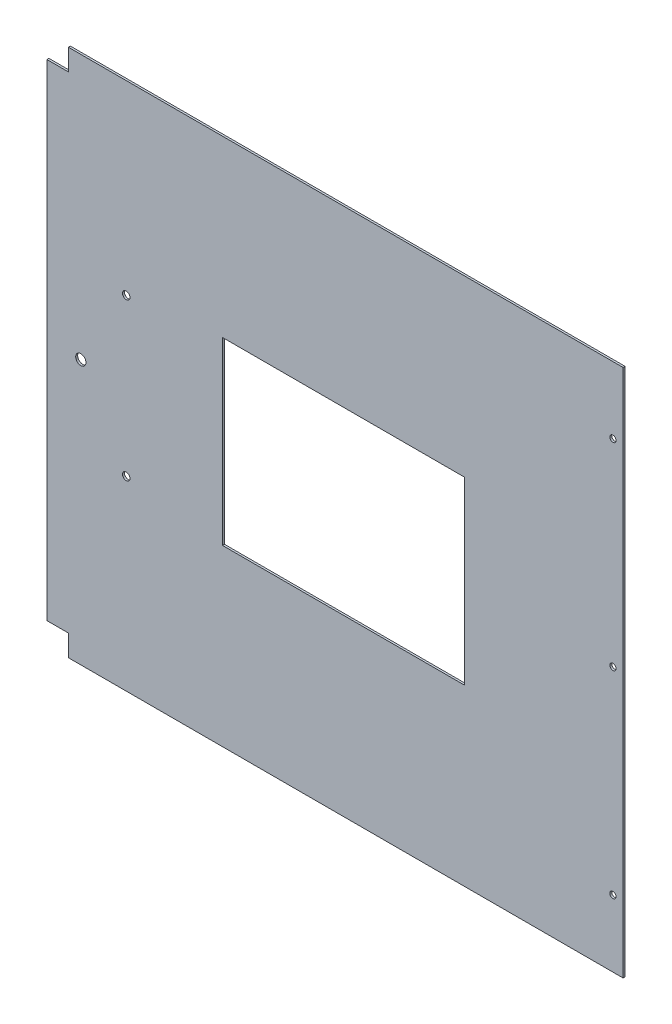
ISO-10303-21;
HEADER;
FILE_DESCRIPTION(('STEP AP214'),'2;1');
FILE_NAME('part.step','',(''),(''),'','','');
FILE_SCHEMA(('AUTOMOTIVE_DESIGN { 1 0 10303 214 1 1 1 1 }'));
ENDSEC;
DATA;
#1=APPLICATION_CONTEXT('core data for automotive mechanical design processes');
#2=APPLICATION_PROTOCOL_DEFINITION('international standard','automotive_design',2000,#1);
#3=PRODUCT_CONTEXT('',#1,'mechanical');
#4=PRODUCT('Part','Part','',(#3));
#5=PRODUCT_RELATED_PRODUCT_CATEGORY('part','',(#4));
#6=PRODUCT_DEFINITION_FORMATION('','',#4);
#7=PRODUCT_DEFINITION_CONTEXT('part definition',#1,'design');
#8=PRODUCT_DEFINITION('design','',#6,#7);
#9=PRODUCT_DEFINITION_SHAPE('','',#8);
#10=(LENGTH_UNIT() NAMED_UNIT(*) SI_UNIT(.MILLI.,.METRE.));
#11=(NAMED_UNIT(*) PLANE_ANGLE_UNIT() SI_UNIT($,.RADIAN.));
#12=(NAMED_UNIT(*) SI_UNIT($,.STERADIAN.) SOLID_ANGLE_UNIT());
#13=UNCERTAINTY_MEASURE_WITH_UNIT(LENGTH_MEASURE(1.E-05),#10,'distance_accuracy_value','');
#14=(GEOMETRIC_REPRESENTATION_CONTEXT(3) GLOBAL_UNCERTAINTY_ASSIGNED_CONTEXT((#13)) GLOBAL_UNIT_ASSIGNED_CONTEXT((#10,
#11,#12)) REPRESENTATION_CONTEXT('',''));
#15=CARTESIAN_POINT('',(0.,0.,0.));
#16=DIRECTION('',(0.,0.,1.));
#17=DIRECTION('',(1.,0.,0.));
#18=AXIS2_PLACEMENT_3D('',#15,#16,#17);
#19=CARTESIAN_POINT('',(0.,0.,-1.524));
#20=DIRECTION('',(0.,0.,-1.));
#21=DIRECTION('',(-1.,0.,0.));
#22=AXIS2_PLACEMENT_3D('',#19,#20,#21);
#23=PLANE('',#22);
#24=CARTESIAN_POINT('',(207.645,152.4,-1.524));
#25=DIRECTION('',(0.,0.,-1.));
#26=DIRECTION('',(-1.,0.,0.));
#27=AXIS2_PLACEMENT_3D('',#24,#25,#26);
#28=CIRCLE('',#27,2.413);
#29=CARTESIAN_POINT('',(205.232,152.4,-1.524));
#30=VERTEX_POINT('',#29);
#31=EDGE_CURVE('E327',#30,#30,#28,.T.);
#32=ORIENTED_EDGE('',*,*,#31,.F.);
#33=EDGE_LOOP('',(#32));
#34=FACE_BOUND('',#33,.T.);
#35=CARTESIAN_POINT('',(-167.767,-60.452,-1.524));
#36=DIRECTION('',(0.,0.,-1.));
#37=DIRECTION('',(-1.,0.,0.));
#38=AXIS2_PLACEMENT_3D('',#35,#36,#37);
#39=CIRCLE('',#38,2.8956);
#40=CARTESIAN_POINT('',(-170.6626,-60.452,-1.524));
#41=VERTEX_POINT('',#40);
#42=EDGE_CURVE('E482',#41,#41,#39,.T.);
#43=ORIENTED_EDGE('',*,*,#42,.F.);
#44=EDGE_LOOP('',(#43));
#45=FACE_BOUND('',#44,.T.);
#46=CARTESIAN_POINT('',(-167.767,60.452,-1.524));
#47=DIRECTION('',(0.,0.,-1.));
#48=DIRECTION('',(-1.,0.,0.));
#49=AXIS2_PLACEMENT_3D('',#46,#47,#48);
#50=CIRCLE('',#49,2.8956);
#51=CARTESIAN_POINT('',(-170.6626,60.452,-1.524));
#52=VERTEX_POINT('',#51);
#53=EDGE_CURVE('E478',#52,#52,#50,.T.);
#54=ORIENTED_EDGE('',*,*,#53,.F.);
#55=EDGE_LOOP('',(#54));
#56=FACE_BOUND('',#55,.T.);
#57=CARTESIAN_POINT('',(-202.819,0.,-1.524));
#58=DIRECTION('',(0.,0.,-1.));
#59=DIRECTION('',(-1.,0.,0.));
#60=AXIS2_PLACEMENT_3D('',#57,#58,#59);
#61=CIRCLE('',#60,3.9624);
#62=CARTESIAN_POINT('',(-206.7814,0.,-1.524));
#63=VERTEX_POINT('',#62);
#64=EDGE_CURVE('E474',#63,#63,#61,.T.);
#65=ORIENTED_EDGE('',*,*,#64,.F.);
#66=EDGE_LOOP('',(#65));
#67=FACE_BOUND('',#66,.T.);
#68=CARTESIAN_POINT('',(207.645,0.,-1.524));
#69=DIRECTION('',(0.,0.,-1.));
#70=DIRECTION('',(-1.,0.,0.));
#71=AXIS2_PLACEMENT_3D('',#68,#69,#70);
#72=CIRCLE('',#71,2.413);
#73=CARTESIAN_POINT('',(205.232,0.,-1.524));
#74=VERTEX_POINT('',#73);
#75=EDGE_CURVE('E470',#74,#74,#72,.T.);
#76=ORIENTED_EDGE('',*,*,#75,.F.);
#77=EDGE_LOOP('',(#76));
#78=FACE_BOUND('',#77,.T.);
#79=CARTESIAN_POINT('',(207.645,-152.4,-1.524));
#80=DIRECTION('',(0.,0.,-1.));
#81=DIRECTION('',(-1.,0.,0.));
#82=AXIS2_PLACEMENT_3D('',#79,#80,#81);
#83=CIRCLE('',#82,2.413);
#84=CARTESIAN_POINT('',(205.232,-152.4,-1.524));
#85=VERTEX_POINT('',#84);
#86=EDGE_CURVE('E466',#85,#85,#83,.T.);
#87=ORIENTED_EDGE('',*,*,#86,.F.);
#88=EDGE_LOOP('',(#87));
#89=FACE_BOUND('',#88,.T.);
#90=DIRECTION('',(0.,-1.,0.));
#91=VECTOR('',#90,1.);
#92=CARTESIAN_POINT('',(93.345,0.,-1.524));
#93=LINE('',#92,#91);
#94=CARTESIAN_POINT('',(93.345,69.469,-1.524));
#95=VERTEX_POINT('',#94);
#96=CARTESIAN_POINT('',(93.345,-69.469,-1.524));
#97=VERTEX_POINT('',#96);
#98=EDGE_CURVE('E463',#95,#97,#93,.T.);
#99=ORIENTED_EDGE('',*,*,#98,.F.);
#100=DIRECTION('',(1.,0.,0.));
#101=VECTOR('',#100,1.);
#102=CARTESIAN_POINT('',(0.,69.469,-1.524));
#103=LINE('',#102,#101);
#104=CARTESIAN_POINT('',(-93.599,69.469,-1.524));
#105=VERTEX_POINT('',#104);
#106=EDGE_CURVE('E447',#105,#95,#103,.T.);
#107=ORIENTED_EDGE('',*,*,#106,.F.);
#108=DIRECTION('',(0.,1.,0.));
#109=VECTOR('',#108,1.);
#110=CARTESIAN_POINT('',(-93.599,0.,-1.524));
#111=LINE('',#110,#109);
#112=CARTESIAN_POINT('',(-93.599,-69.469,-1.524));
#113=VERTEX_POINT('',#112);
#114=EDGE_CURVE('E457',#113,#105,#111,.T.);
#115=ORIENTED_EDGE('',*,*,#114,.F.);
#116=DIRECTION('',(-1.,0.,0.));
#117=VECTOR('',#116,1.);
#118=CARTESIAN_POINT('',(0.,-69.469,-1.524));
#119=LINE('',#118,#117);
#120=EDGE_CURVE('E460',#97,#113,#119,.T.);
#121=ORIENTED_EDGE('',*,*,#120,.F.);
#122=EDGE_LOOP('',(#99,#107,#115,#121));
#123=FACE_BOUND('',#122,.T.);
#124=DIRECTION('',(0.,1.,0.));
#125=VECTOR('',#124,1.);
#126=CARTESIAN_POINT('',(215.519,-190.5,-1.524));
#127=LINE('',#126,#125);
#128=CARTESIAN_POINT('',(215.519,-203.948962531012,-1.52399999999989));
#129=VERTEX_POINT('',#128);
#130=CARTESIAN_POINT('',(215.519,203.948962531012,-1.52399999999989));
#131=VERTEX_POINT('',#130);
#132=EDGE_CURVE('E326',#129,#131,#127,.T.);
#133=ORIENTED_EDGE('',*,*,#132,.F.);
#134=DIRECTION('',(-1.,0.,0.));
#135=VECTOR('',#134,1.);
#136=CARTESIAN_POINT('',(0.,-203.948962531012,-1.52399999999989));
#137=LINE('',#136,#135);
#138=CARTESIAN_POINT('',(-212.471,-203.948962531012,-1.52399999999989));
#139=VERTEX_POINT('',#138);
#140=EDGE_CURVE('E389',#129,#139,#137,.T.);
#141=ORIENTED_EDGE('',*,*,#140,.T.);
#142=DIRECTION('',(0.,1.,0.));
#143=VECTOR('',#142,1.);
#144=CARTESIAN_POINT('',(-212.471,-189.223481265506,-1.52400000000002));
#145=LINE('',#144,#143);
#146=CARTESIAN_POINT('',(-212.471,-187.452,-1.524));
#147=VERTEX_POINT('',#146);
#148=EDGE_CURVE('E399',#139,#147,#145,.T.);
#149=ORIENTED_EDGE('',*,*,#148,.T.);
#150=DIRECTION('',(-1.,0.,0.));
#151=VECTOR('',#150,1.);
#152=CARTESIAN_POINT('',(-214.242481265506,-187.452,-1.524));
#153=LINE('',#152,#151);
#154=CARTESIAN_POINT('',(-228.967962531012,-187.452,-1.52399999999991));
#155=VERTEX_POINT('',#154);
#156=EDGE_CURVE('E372',#147,#155,#153,.T.);
#157=ORIENTED_EDGE('',*,*,#156,.T.);
#158=DIRECTION('',(0.,1.,0.));
#159=VECTOR('',#158,1.);
#160=CARTESIAN_POINT('',(-228.967962531012,0.,-1.52399999999989));
#161=LINE('',#160,#159);
#162=CARTESIAN_POINT('',(-228.967962531012,187.452,-1.52399999999986));
#163=VERTEX_POINT('',#162);
#164=EDGE_CURVE('E361',#155,#163,#161,.T.);
#165=ORIENTED_EDGE('',*,*,#164,.T.);
#166=DIRECTION('',(-1.,0.,0.));
#167=VECTOR('',#166,1.);
#168=CARTESIAN_POINT('',(-214.242481265506,187.452,-1.524));
#169=LINE('',#168,#167);
#170=CARTESIAN_POINT('',(-212.471,187.452,-1.524));
#171=VERTEX_POINT('',#170);
#172=EDGE_CURVE('E375',#163,#171,#169,.F.);
#173=ORIENTED_EDGE('',*,*,#172,.T.);
#174=DIRECTION('',(0.,1.,0.));
#175=VECTOR('',#174,1.);
#176=CARTESIAN_POINT('',(-212.471,189.223481265506,-1.524));
#177=LINE('',#176,#175);
#178=CARTESIAN_POINT('',(-212.471,203.948962531012,-1.52399999999989));
#179=VERTEX_POINT('',#178);
#180=EDGE_CURVE('E349',#171,#179,#177,.T.);
#181=ORIENTED_EDGE('',*,*,#180,.T.);
#182=DIRECTION('',(-1.,0.,0.));
#183=VECTOR('',#182,1.);
#184=CARTESIAN_POINT('',(0.,203.948962531012,-1.52399999999989));
#185=LINE('',#184,#183);
#186=EDGE_CURVE('E336',#179,#131,#185,.F.);
#187=ORIENTED_EDGE('',*,*,#186,.T.);
#188=EDGE_LOOP('',(#133,#141,#149,#157,#165,#173,#181,#187));
#189=FACE_BOUND('',#188,.T.);
#190=ADVANCED_FACE('F224',(#34,#45,#56,#67,#78,#89,#123,#189),#23,.T.);
#191=CARTESIAN_POINT('',(0.,0.,0.));
#192=DIRECTION('',(0.,0.,-1.));
#193=DIRECTION('',(-1.,0.,0.));
#194=AXIS2_PLACEMENT_3D('',#191,#192,#193);
#195=PLANE('',#194);
#196=CARTESIAN_POINT('',(207.645,152.4,0.));
#197=DIRECTION('',(0.,0.,1.));
#198=DIRECTION('',(1.,0.,0.));
#199=AXIS2_PLACEMENT_3D('',#196,#197,#198);
#200=CIRCLE('',#199,2.413);
#201=CARTESIAN_POINT('',(210.058,152.4,0.));
#202=VERTEX_POINT('',#201);
#203=EDGE_CURVE('E411',#202,#202,#200,.T.);
#204=ORIENTED_EDGE('',*,*,#203,.F.);
#205=EDGE_LOOP('',(#204));
#206=FACE_BOUND('',#205,.T.);
#207=CARTESIAN_POINT('',(-167.767,-60.452,0.));
#208=DIRECTION('',(0.,0.,1.));
#209=DIRECTION('',(1.,0.,0.));
#210=AXIS2_PLACEMENT_3D('',#207,#208,#209);
#211=CIRCLE('',#210,2.8956);
#212=CARTESIAN_POINT('',(-164.8714,-60.452,0.));
#213=VERTEX_POINT('',#212);
#214=EDGE_CURVE('E415',#213,#213,#211,.T.);
#215=ORIENTED_EDGE('',*,*,#214,.F.);
#216=EDGE_LOOP('',(#215));
#217=FACE_BOUND('',#216,.T.);
#218=CARTESIAN_POINT('',(-167.767,60.452,0.));
#219=DIRECTION('',(0.,0.,1.));
#220=DIRECTION('',(1.,0.,0.));
#221=AXIS2_PLACEMENT_3D('',#218,#219,#220);
#222=CIRCLE('',#221,2.8956);
#223=CARTESIAN_POINT('',(-164.8714,60.452,0.));
#224=VERTEX_POINT('',#223);
#225=EDGE_CURVE('E419',#224,#224,#222,.T.);
#226=ORIENTED_EDGE('',*,*,#225,.F.);
#227=EDGE_LOOP('',(#226));
#228=FACE_BOUND('',#227,.T.);
#229=CARTESIAN_POINT('',(-202.819,0.,0.));
#230=DIRECTION('',(0.,0.,1.));
#231=DIRECTION('',(1.,0.,0.));
#232=AXIS2_PLACEMENT_3D('',#229,#230,#231);
#233=CIRCLE('',#232,3.9624);
#234=CARTESIAN_POINT('',(-198.8566,0.,0.));
#235=VERTEX_POINT('',#234);
#236=EDGE_CURVE('E423',#235,#235,#233,.T.);
#237=ORIENTED_EDGE('',*,*,#236,.F.);
#238=EDGE_LOOP('',(#237));
#239=FACE_BOUND('',#238,.T.);
#240=CARTESIAN_POINT('',(207.645,0.,0.));
#241=DIRECTION('',(0.,0.,1.));
#242=DIRECTION('',(1.,0.,0.));
#243=AXIS2_PLACEMENT_3D('',#240,#241,#242);
#244=CIRCLE('',#243,2.413);
#245=CARTESIAN_POINT('',(210.058,0.,0.));
#246=VERTEX_POINT('',#245);
#247=EDGE_CURVE('E407',#246,#246,#244,.T.);
#248=ORIENTED_EDGE('',*,*,#247,.F.);
#249=EDGE_LOOP('',(#248));
#250=FACE_BOUND('',#249,.T.);
#251=CARTESIAN_POINT('',(207.645,-152.4,0.));
#252=DIRECTION('',(0.,0.,1.));
#253=DIRECTION('',(1.,0.,0.));
#254=AXIS2_PLACEMENT_3D('',#251,#252,#253);
#255=CIRCLE('',#254,2.413);
#256=CARTESIAN_POINT('',(210.058,-152.4,0.));
#257=VERTEX_POINT('',#256);
#258=EDGE_CURVE('E403',#257,#257,#255,.T.);
#259=ORIENTED_EDGE('',*,*,#258,.F.);
#260=EDGE_LOOP('',(#259));
#261=FACE_BOUND('',#260,.T.);
#262=DIRECTION('',(-1.,0.,0.));
#263=VECTOR('',#262,1.);
#264=CARTESIAN_POINT('',(-93.599,69.469,0.));
#265=LINE('',#264,#263);
#266=CARTESIAN_POINT('',(93.345,69.469,0.));
#267=VERTEX_POINT('',#266);
#268=CARTESIAN_POINT('',(-93.599,69.469,0.));
#269=VERTEX_POINT('',#268);
#270=EDGE_CURVE('E432',#267,#269,#265,.T.);
#271=ORIENTED_EDGE('',*,*,#270,.F.);
#272=DIRECTION('',(0.,1.,0.));
#273=VECTOR('',#272,1.);
#274=CARTESIAN_POINT('',(93.345,-69.469,0.));
#275=LINE('',#274,#273);
#276=CARTESIAN_POINT('',(93.345,-69.469,0.));
#277=VERTEX_POINT('',#276);
#278=EDGE_CURVE('E248',#277,#267,#275,.T.);
#279=ORIENTED_EDGE('',*,*,#278,.F.);
#280=DIRECTION('',(1.,0.,0.));
#281=VECTOR('',#280,1.);
#282=CARTESIAN_POINT('',(-93.599,-69.469,0.));
#283=LINE('',#282,#281);
#284=CARTESIAN_POINT('',(-93.599,-69.469,0.));
#285=VERTEX_POINT('',#284);
#286=EDGE_CURVE('E439',#285,#277,#283,.T.);
#287=ORIENTED_EDGE('',*,*,#286,.F.);
#288=DIRECTION('',(0.,-1.,0.));
#289=VECTOR('',#288,1.);
#290=CARTESIAN_POINT('',(-93.599,-69.469,0.));
#291=LINE('',#290,#289);
#292=EDGE_CURVE('E435',#269,#285,#291,.T.);
#293=ORIENTED_EDGE('',*,*,#292,.F.);
#294=EDGE_LOOP('',(#271,#279,#287,#293));
#295=FACE_BOUND('',#294,.T.);
#296=DIRECTION('',(-1.,0.,0.));
#297=VECTOR('',#296,1.);
#298=CARTESIAN_POINT('',(-214.242481265506,-187.452,0.));
#299=LINE('',#298,#297);
#300=CARTESIAN_POINT('',(-212.471,-187.452,0.));
#301=VERTEX_POINT('',#300);
#302=CARTESIAN_POINT('',(-228.967962531012,-187.452,0.));
#303=VERTEX_POINT('',#302);
#304=EDGE_CURVE('E360',#301,#303,#299,.T.);
#305=ORIENTED_EDGE('',*,*,#304,.F.);
#306=DIRECTION('',(0.,1.,0.));
#307=VECTOR('',#306,1.);
#308=CARTESIAN_POINT('',(-212.471,-189.223481265506,0.));
#309=LINE('',#308,#307);
#310=CARTESIAN_POINT('',(-212.471,-203.948962531012,1.11022302462516E-13));
#311=VERTEX_POINT('',#310);
#312=EDGE_CURVE('E388',#311,#301,#309,.T.);
#313=ORIENTED_EDGE('',*,*,#312,.F.);
#314=DIRECTION('',(1.,0.,0.));
#315=VECTOR('',#314,1.);
#316=CARTESIAN_POINT('',(215.519,-203.948962531012,1.11022302462516E-13));
#317=LINE('',#316,#315);
#318=CARTESIAN_POINT('',(215.519,-203.948962531012,1.11022302462516E-13));
#319=VERTEX_POINT('',#318);
#320=EDGE_CURVE('E321',#319,#311,#317,.F.);
#321=ORIENTED_EDGE('',*,*,#320,.F.);
#322=DIRECTION('',(0.,1.,0.));
#323=VECTOR('',#322,1.);
#324=CARTESIAN_POINT('',(215.519,-190.5,0.));
#325=LINE('',#324,#323);
#326=CARTESIAN_POINT('',(215.519,203.948962531012,1.11022302462516E-13));
#327=VERTEX_POINT('',#326);
#328=EDGE_CURVE('E314',#319,#327,#325,.T.);
#329=ORIENTED_EDGE('',*,*,#328,.T.);
#330=DIRECTION('',(1.,0.,0.));
#331=VECTOR('',#330,1.);
#332=CARTESIAN_POINT('',(215.519,203.948962531012,1.11022302462516E-13));
#333=LINE('',#332,#331);
#334=CARTESIAN_POINT('',(-212.471,203.948962531012,1.11022302462516E-13));
#335=VERTEX_POINT('',#334);
#336=EDGE_CURVE('E319',#335,#327,#333,.T.);
#337=ORIENTED_EDGE('',*,*,#336,.F.);
#338=DIRECTION('',(0.,1.,0.));
#339=VECTOR('',#338,1.);
#340=CARTESIAN_POINT('',(-212.471,189.223481265506,0.));
#341=LINE('',#340,#339);
#342=CARTESIAN_POINT('',(-212.471,187.452,0.));
#343=VERTEX_POINT('',#342);
#344=EDGE_CURVE('E353',#343,#335,#341,.T.);
#345=ORIENTED_EDGE('',*,*,#344,.F.);
#346=DIRECTION('',(-1.,0.,0.));
#347=VECTOR('',#346,1.);
#348=CARTESIAN_POINT('',(-214.242481265506,187.452,0.));
#349=LINE('',#348,#347);
#350=CARTESIAN_POINT('',(-228.967962531012,187.452,1.38777878078145E-13));
#351=VERTEX_POINT('',#350);
#352=EDGE_CURVE('E376',#351,#343,#349,.F.);
#353=ORIENTED_EDGE('',*,*,#352,.F.);
#354=DIRECTION('',(0.,-1.,0.));
#355=VECTOR('',#354,1.);
#356=CARTESIAN_POINT('',(-228.967962531012,-187.452,0.));
#357=LINE('',#356,#355);
#358=EDGE_CURVE('E352',#303,#351,#357,.F.);
#359=ORIENTED_EDGE('',*,*,#358,.F.);
#360=EDGE_LOOP('',(#305,#313,#321,#329,#337,#345,#353,#359));
#361=FACE_BOUND('',#360,.T.);
#362=ADVANCED_FACE('F226',(#206,#217,#228,#239,#250,#261,#295,#361),#195,.F.);
#363=CARTESIAN_POINT('',(215.519,-190.5,-1.524));
#364=DIRECTION('',(1.,0.,0.));
#365=DIRECTION('',(0.,0.,-1.));
#366=AXIS2_PLACEMENT_3D('',#363,#364,#365);
#367=PLANE('',#366);
#368=ORIENTED_EDGE('',*,*,#328,.F.);
#369=DIRECTION('',(0.,0.,-1.));
#370=VECTOR('',#369,1.);
#371=CARTESIAN_POINT('',(215.519,-203.948962531012,1.11022302462516E-13));
#372=LINE('',#371,#370);
#373=EDGE_CURVE('E385',#319,#129,#372,.T.);
#374=ORIENTED_EDGE('',*,*,#373,.T.);
#375=ORIENTED_EDGE('',*,*,#132,.T.);
#376=DIRECTION('',(0.,0.,-1.));
#377=VECTOR('',#376,1.);
#378=CARTESIAN_POINT('',(215.519,203.948962531012,1.11022302462516E-13));
#379=LINE('',#378,#377);
#380=EDGE_CURVE('E330',#327,#131,#379,.T.);
#381=ORIENTED_EDGE('',*,*,#380,.F.);
#382=EDGE_LOOP('',(#368,#374,#375,#381));
#383=FACE_BOUND('',#382,.T.);
#384=ADVANCED_FACE('F331',(#383),#367,.T.);
#385=CARTESIAN_POINT('',(93.345,-69.469,-16.002));
#386=DIRECTION('',(1.,0.,0.));
#387=DIRECTION('',(0.,0.,-1.));
#388=AXIS2_PLACEMENT_3D('',#385,#386,#387);
#389=PLANE('',#388);
#390=ORIENTED_EDGE('',*,*,#98,.T.);
#391=DIRECTION('',(0.,0.,1.));
#392=VECTOR('',#391,1.);
#393=CARTESIAN_POINT('',(93.345,-69.469,-16.002));
#394=LINE('',#393,#392);
#395=EDGE_CURVE('E444',#97,#277,#394,.T.);
#396=ORIENTED_EDGE('',*,*,#395,.T.);
#397=ORIENTED_EDGE('',*,*,#278,.T.);
#398=DIRECTION('',(0.,0.,1.));
#399=VECTOR('',#398,1.);
#400=CARTESIAN_POINT('',(93.345,69.469,-16.002));
#401=LINE('',#400,#399);
#402=EDGE_CURVE('E443',#95,#267,#401,.T.);
#403=ORIENTED_EDGE('',*,*,#402,.F.);
#404=EDGE_LOOP('',(#390,#396,#397,#403));
#405=FACE_BOUND('',#404,.T.);
#406=ADVANCED_FACE('F535',(#405),#389,.F.);
#407=CARTESIAN_POINT('',(-93.599,-69.469,-16.002));
#408=DIRECTION('',(0.,-1.,0.));
#409=DIRECTION('',(0.,0.,-1.));
#410=AXIS2_PLACEMENT_3D('',#407,#408,#409);
#411=PLANE('',#410);
#412=ORIENTED_EDGE('',*,*,#120,.T.);
#413=DIRECTION('',(0.,0.,1.));
#414=VECTOR('',#413,1.);
#415=CARTESIAN_POINT('',(-93.599,-69.469,-16.002));
#416=LINE('',#415,#414);
#417=EDGE_CURVE('E448',#113,#285,#416,.T.);
#418=ORIENTED_EDGE('',*,*,#417,.T.);
#419=ORIENTED_EDGE('',*,*,#286,.T.);
#420=ORIENTED_EDGE('',*,*,#395,.F.);
#421=EDGE_LOOP('',(#412,#418,#419,#420));
#422=FACE_BOUND('',#421,.T.);
#423=ADVANCED_FACE('F541',(#422),#411,.F.);
#424=CARTESIAN_POINT('',(-93.599,-69.469,-16.002));
#425=DIRECTION('',(-1.,0.,0.));
#426=DIRECTION('',(0.,0.,1.));
#427=AXIS2_PLACEMENT_3D('',#424,#425,#426);
#428=PLANE('',#427);
#429=ORIENTED_EDGE('',*,*,#114,.T.);
#430=DIRECTION('',(0.,0.,1.));
#431=VECTOR('',#430,1.);
#432=CARTESIAN_POINT('',(-93.599,69.469,-16.002));
#433=LINE('',#432,#431);
#434=EDGE_CURVE('E240',#105,#269,#433,.T.);
#435=ORIENTED_EDGE('',*,*,#434,.T.);
#436=ORIENTED_EDGE('',*,*,#292,.T.);
#437=ORIENTED_EDGE('',*,*,#417,.F.);
#438=EDGE_LOOP('',(#429,#435,#436,#437));
#439=FACE_BOUND('',#438,.T.);
#440=ADVANCED_FACE('F545',(#439),#428,.F.);
#441=CARTESIAN_POINT('',(-93.599,69.469,-16.002));
#442=DIRECTION('',(0.,1.,0.));
#443=DIRECTION('',(0.,0.,1.));
#444=AXIS2_PLACEMENT_3D('',#441,#442,#443);
#445=PLANE('',#444);
#446=ORIENTED_EDGE('',*,*,#106,.T.);
#447=ORIENTED_EDGE('',*,*,#402,.T.);
#448=ORIENTED_EDGE('',*,*,#270,.T.);
#449=ORIENTED_EDGE('',*,*,#434,.F.);
#450=EDGE_LOOP('',(#446,#447,#448,#449));
#451=FACE_BOUND('',#450,.T.);
#452=ADVANCED_FACE('F560',(#451),#445,.F.);
#453=CARTESIAN_POINT('',(207.645,-152.4,-16.002));
#454=DIRECTION('',(0.,0.,1.));
#455=DIRECTION('',(1.,0.,0.));
#456=AXIS2_PLACEMENT_3D('',#453,#454,#455);
#457=CYLINDRICAL_SURFACE('',#456,2.413);
#458=ORIENTED_EDGE('',*,*,#86,.T.);
#459=EDGE_LOOP('',(#458));
#460=FACE_BOUND('',#459,.T.);
#461=ORIENTED_EDGE('',*,*,#258,.T.);
#462=EDGE_LOOP('',(#461));
#463=FACE_BOUND('',#462,.T.);
#464=ADVANCED_FACE('F562',(#460,#463),#457,.F.);
#465=CARTESIAN_POINT('',(207.645,0.,-16.002));
#466=DIRECTION('',(0.,0.,1.));
#467=DIRECTION('',(1.,0.,0.));
#468=AXIS2_PLACEMENT_3D('',#465,#466,#467);
#469=CYLINDRICAL_SURFACE('',#468,2.413);
#470=ORIENTED_EDGE('',*,*,#75,.T.);
#471=EDGE_LOOP('',(#470));
#472=FACE_BOUND('',#471,.T.);
#473=ORIENTED_EDGE('',*,*,#247,.T.);
#474=EDGE_LOOP('',(#473));
#475=FACE_BOUND('',#474,.T.);
#476=ADVANCED_FACE('F567',(#472,#475),#469,.F.);
#477=CARTESIAN_POINT('',(-202.819,0.,-16.002));
#478=DIRECTION('',(0.,0.,1.));
#479=DIRECTION('',(1.,0.,0.));
#480=AXIS2_PLACEMENT_3D('',#477,#478,#479);
#481=CYLINDRICAL_SURFACE('',#480,3.9624);
#482=ORIENTED_EDGE('',*,*,#64,.T.);
#483=EDGE_LOOP('',(#482));
#484=FACE_BOUND('',#483,.T.);
#485=ORIENTED_EDGE('',*,*,#236,.T.);
#486=EDGE_LOOP('',(#485));
#487=FACE_BOUND('',#486,.T.);
#488=ADVANCED_FACE('F576',(#484,#487),#481,.F.);
#489=CARTESIAN_POINT('',(-167.767,60.452,-16.002));
#490=DIRECTION('',(0.,0.,1.));
#491=DIRECTION('',(1.,0.,0.));
#492=AXIS2_PLACEMENT_3D('',#489,#490,#491);
#493=CYLINDRICAL_SURFACE('',#492,2.8956);
#494=ORIENTED_EDGE('',*,*,#53,.T.);
#495=EDGE_LOOP('',(#494));
#496=FACE_BOUND('',#495,.T.);
#497=ORIENTED_EDGE('',*,*,#225,.T.);
#498=EDGE_LOOP('',(#497));
#499=FACE_BOUND('',#498,.T.);
#500=ADVANCED_FACE('F572',(#496,#499),#493,.F.);
#501=CARTESIAN_POINT('',(-167.767,-60.452,-16.002));
#502=DIRECTION('',(0.,0.,1.));
#503=DIRECTION('',(1.,0.,0.));
#504=AXIS2_PLACEMENT_3D('',#501,#502,#503);
#505=CYLINDRICAL_SURFACE('',#504,2.8956);
#506=ORIENTED_EDGE('',*,*,#42,.T.);
#507=EDGE_LOOP('',(#506));
#508=FACE_BOUND('',#507,.T.);
#509=ORIENTED_EDGE('',*,*,#214,.T.);
#510=EDGE_LOOP('',(#509));
#511=FACE_BOUND('',#510,.T.);
#512=ADVANCED_FACE('F575',(#508,#511),#505,.F.);
#513=CARTESIAN_POINT('',(207.645,152.4,-16.002));
#514=DIRECTION('',(0.,0.,1.));
#515=DIRECTION('',(1.,0.,0.));
#516=AXIS2_PLACEMENT_3D('',#513,#514,#515);
#517=CYLINDRICAL_SURFACE('',#516,2.413);
#518=ORIENTED_EDGE('',*,*,#31,.T.);
#519=EDGE_LOOP('',(#518));
#520=FACE_BOUND('',#519,.T.);
#521=ORIENTED_EDGE('',*,*,#203,.T.);
#522=EDGE_LOOP('',(#521));
#523=FACE_BOUND('',#522,.T.);
#524=ADVANCED_FACE('F581',(#520,#523),#517,.F.);
#525=CARTESIAN_POINT('',(-212.471,-189.223481265506,-0.792480000000019));
#526=DIRECTION('',(-1.,0.,0.));
#527=DIRECTION('',(0.,1.,0.));
#528=AXIS2_PLACEMENT_3D('',#525,#526,#527);
#529=PLANE('',#528);
#530=ORIENTED_EDGE('',*,*,#312,.T.);
#531=DIRECTION('',(0.,0.,1.));
#532=VECTOR('',#531,1.);
#533=CARTESIAN_POINT('',(-212.471,-187.452,-1.52400000000002));
#534=LINE('',#533,#532);
#535=EDGE_CURVE('E233',#147,#301,#534,.T.);
#536=ORIENTED_EDGE('',*,*,#535,.F.);
#537=ORIENTED_EDGE('',*,*,#148,.F.);
#538=DIRECTION('',(0.,0.,-1.));
#539=VECTOR('',#538,1.);
#540=CARTESIAN_POINT('',(-212.471,-203.948962531012,1.11022302462516E-13));
#541=LINE('',#540,#539);
#542=EDGE_CURVE('E393',#311,#139,#541,.T.);
#543=ORIENTED_EDGE('',*,*,#542,.F.);
#544=EDGE_LOOP('',(#530,#536,#537,#543));
#545=FACE_BOUND('',#544,.T.);
#546=ADVANCED_FACE('F499',(#545),#529,.T.);
#547=CARTESIAN_POINT('',(215.519,-203.948962531012,1.11022302462516E-13));
#548=DIRECTION('',(0.,-1.,0.));
#549=DIRECTION('',(0.,0.,-1.));
#550=AXIS2_PLACEMENT_3D('',#547,#548,#549);
#551=PLANE('',#550);
#552=ORIENTED_EDGE('',*,*,#140,.F.);
#553=ORIENTED_EDGE('',*,*,#373,.F.);
#554=ORIENTED_EDGE('',*,*,#320,.T.);
#555=ORIENTED_EDGE('',*,*,#542,.T.);
#556=EDGE_LOOP('',(#552,#553,#554,#555));
#557=FACE_BOUND('',#556,.T.);
#558=ADVANCED_FACE('F502',(#557),#551,.T.);
#559=CARTESIAN_POINT('',(-214.242481265506,-187.452,-0.792480000000003));
#560=DIRECTION('',(0.,-1.,0.));
#561=DIRECTION('',(-1.,0.,0.));
#562=AXIS2_PLACEMENT_3D('',#559,#560,#561);
#563=PLANE('',#562);
#564=ORIENTED_EDGE('',*,*,#535,.T.);
#565=ORIENTED_EDGE('',*,*,#304,.T.);
#566=DIRECTION('',(0.,0.,-1.));
#567=VECTOR('',#566,1.);
#568=CARTESIAN_POINT('',(-228.967962531012,-187.452,0.));
#569=LINE('',#568,#567);
#570=EDGE_CURVE('E356',#303,#155,#569,.T.);
#571=ORIENTED_EDGE('',*,*,#570,.T.);
#572=ORIENTED_EDGE('',*,*,#156,.F.);
#573=EDGE_LOOP('',(#564,#565,#571,#572));
#574=FACE_BOUND('',#573,.T.);
#575=ADVANCED_FACE('F494',(#574),#563,.T.);
#576=CARTESIAN_POINT('',(-214.242481265506,187.452,-0.792480000000003));
#577=DIRECTION('',(0.,-1.,0.));
#578=DIRECTION('',(-1.,0.,0.));
#579=AXIS2_PLACEMENT_3D('',#576,#577,#578);
#580=PLANE('',#579);
#581=ORIENTED_EDGE('',*,*,#352,.T.);
#582=DIRECTION('',(0.,0.,1.));
#583=VECTOR('',#582,1.);
#584=CARTESIAN_POINT('',(-212.471,187.452,-1.524));
#585=LINE('',#584,#583);
#586=EDGE_CURVE('E13',#171,#343,#585,.T.);
#587=ORIENTED_EDGE('',*,*,#586,.F.);
#588=ORIENTED_EDGE('',*,*,#172,.F.);
#589=DIRECTION('',(0.,0.,-1.));
#590=VECTOR('',#589,1.);
#591=CARTESIAN_POINT('',(-228.967962531012,187.452,1.38777878078145E-13));
#592=LINE('',#591,#590);
#593=EDGE_CURVE('E365',#351,#163,#592,.T.);
#594=ORIENTED_EDGE('',*,*,#593,.F.);
#595=EDGE_LOOP('',(#581,#587,#588,#594));
#596=FACE_BOUND('',#595,.T.);
#597=ADVANCED_FACE('F512',(#596),#580,.F.);
#598=CARTESIAN_POINT('',(-228.967962531012,-187.452,0.));
#599=DIRECTION('',(-1.,0.,0.));
#600=DIRECTION('',(0.,0.,1.));
#601=AXIS2_PLACEMENT_3D('',#598,#599,#600);
#602=PLANE('',#601);
#603=ORIENTED_EDGE('',*,*,#164,.F.);
#604=ORIENTED_EDGE('',*,*,#570,.F.);
#605=ORIENTED_EDGE('',*,*,#358,.T.);
#606=ORIENTED_EDGE('',*,*,#593,.T.);
#607=EDGE_LOOP('',(#603,#604,#605,#606));
#608=FACE_BOUND('',#607,.T.);
#609=ADVANCED_FACE('F515',(#608),#602,.T.);
#610=CARTESIAN_POINT('',(-212.471,189.223481265506,-0.792480000000003));
#611=DIRECTION('',(-1.,0.,0.));
#612=DIRECTION('',(0.,1.,0.));
#613=AXIS2_PLACEMENT_3D('',#610,#611,#612);
#614=PLANE('',#613);
#615=ORIENTED_EDGE('',*,*,#586,.T.);
#616=ORIENTED_EDGE('',*,*,#344,.T.);
#617=DIRECTION('',(0.,0.,-1.));
#618=VECTOR('',#617,1.);
#619=CARTESIAN_POINT('',(-212.471,203.948962531012,1.11022302462516E-13));
#620=LINE('',#619,#618);
#621=EDGE_CURVE('E341',#335,#179,#620,.T.);
#622=ORIENTED_EDGE('',*,*,#621,.T.);
#623=ORIENTED_EDGE('',*,*,#180,.F.);
#624=EDGE_LOOP('',(#615,#616,#622,#623));
#625=FACE_BOUND('',#624,.T.);
#626=ADVANCED_FACE('F508',(#625),#614,.T.);
#627=CARTESIAN_POINT('',(215.519,203.948962531012,1.11022302462516E-13));
#628=DIRECTION('',(0.,1.,0.));
#629=DIRECTION('',(0.,0.,1.));
#630=AXIS2_PLACEMENT_3D('',#627,#628,#629);
#631=PLANE('',#630);
#632=ORIENTED_EDGE('',*,*,#186,.F.);
#633=ORIENTED_EDGE('',*,*,#621,.F.);
#634=ORIENTED_EDGE('',*,*,#336,.T.);
#635=ORIENTED_EDGE('',*,*,#380,.T.);
#636=EDGE_LOOP('',(#632,#633,#634,#635));
#637=FACE_BOUND('',#636,.T.);
#638=ADVANCED_FACE('F339',(#637),#631,.T.);
#639=CLOSED_SHELL('',(#190,#362,#384,#406,#423,#440,#452,#464,#476,#488,#500,#512,#524,#546,
#558,#575,#597,#609,#626,#638));
#640=MANIFOLD_SOLID_BREP('B2',#639);
#641=ADVANCED_BREP_SHAPE_REPRESENTATION('',(#18,#640),#14);
#642=SHAPE_DEFINITION_REPRESENTATION(#9,#641);
ENDSEC;
END-ISO-10303-21;
